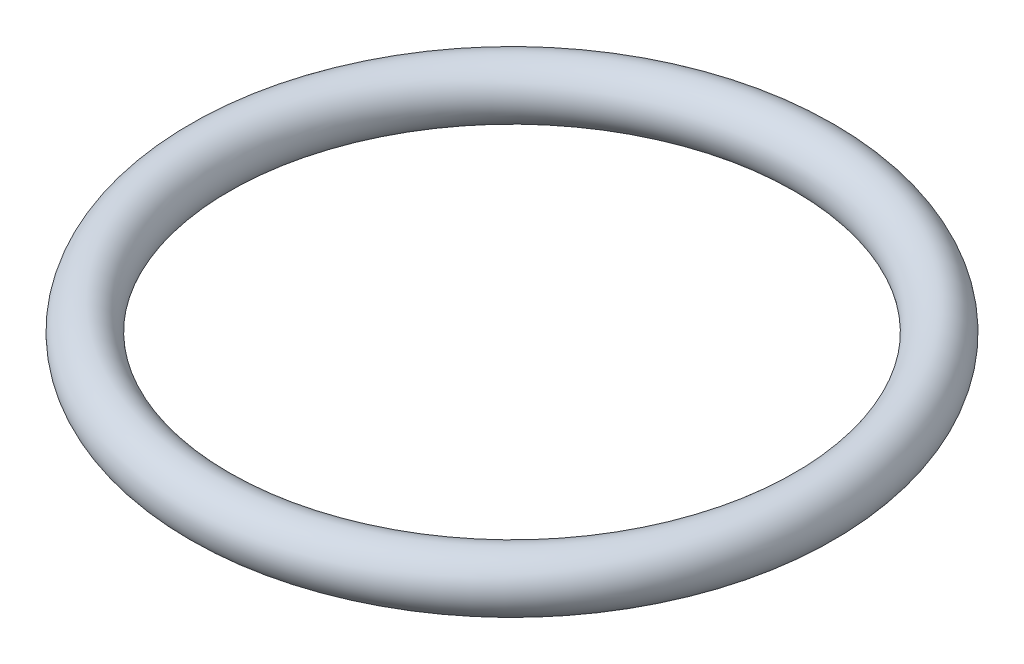
ISO-10303-21;
HEADER;
FILE_DESCRIPTION(('STEP AP214'),'2;1');
FILE_NAME('part.step','',(''),(''),'','','');
FILE_SCHEMA(('AUTOMOTIVE_DESIGN { 1 0 10303 214 1 1 1 1 }'));
ENDSEC;
DATA;
#1=APPLICATION_CONTEXT('core data for automotive mechanical design processes');
#2=APPLICATION_PROTOCOL_DEFINITION('international standard','automotive_design',2000,#1);
#3=PRODUCT_CONTEXT('',#1,'mechanical');
#4=PRODUCT('Part','Part','',(#3));
#5=PRODUCT_RELATED_PRODUCT_CATEGORY('part','',(#4));
#6=PRODUCT_DEFINITION_FORMATION('','',#4);
#7=PRODUCT_DEFINITION_CONTEXT('part definition',#1,'design');
#8=PRODUCT_DEFINITION('design','',#6,#7);
#9=PRODUCT_DEFINITION_SHAPE('','',#8);
#10=(LENGTH_UNIT() NAMED_UNIT(*) SI_UNIT(.MILLI.,.METRE.));
#11=(NAMED_UNIT(*) PLANE_ANGLE_UNIT() SI_UNIT($,.RADIAN.));
#12=(NAMED_UNIT(*) SI_UNIT($,.STERADIAN.) SOLID_ANGLE_UNIT());
#13=UNCERTAINTY_MEASURE_WITH_UNIT(LENGTH_MEASURE(1.E-05),#10,'distance_accuracy_value','');
#14=(GEOMETRIC_REPRESENTATION_CONTEXT(3) GLOBAL_UNCERTAINTY_ASSIGNED_CONTEXT((#13)) GLOBAL_UNIT_ASSIGNED_CONTEXT((#10,
#11,#12)) REPRESENTATION_CONTEXT('',''));
#15=CARTESIAN_POINT('',(0.,0.,0.));
#16=DIRECTION('',(0.,0.,1.));
#17=DIRECTION('',(1.,0.,0.));
#18=AXIS2_PLACEMENT_3D('',#15,#16,#17);
#19=CARTESIAN_POINT('',(0.,0.,0.));
#20=DIRECTION('',(0.,1.,0.));
#21=DIRECTION('',(0.,0.,1.));
#22=AXIS2_PLACEMENT_3D('',#19,#20,#21);
#23=TOROIDAL_SURFACE('',#22,8.73125,0.793749999999999);
#24=CARTESIAN_POINT('',(0.,0.,9.525));
#25=VERTEX_POINT('',#24);
#26=VERTEX_LOOP('',#25);
#27=FACE_BOUND('',#26,.T.);
#28=ADVANCED_FACE('F26',(#27),#23,.T.);
#29=CLOSED_SHELL('',(#28));
#30=MANIFOLD_SOLID_BREP('B2',#29);
#31=ADVANCED_BREP_SHAPE_REPRESENTATION('',(#18,#30),#14);
#32=SHAPE_DEFINITION_REPRESENTATION(#9,#31);
ENDSEC;
END-ISO-10303-21;
